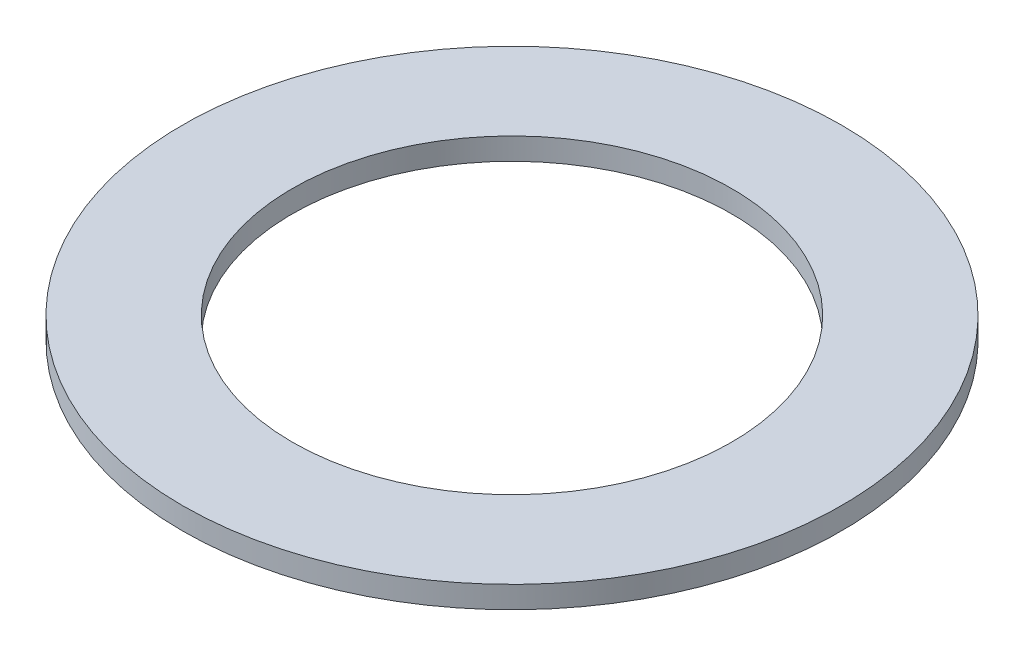
ISO-10303-21;
HEADER;
FILE_DESCRIPTION(('STEP AP214'),'2;1');
FILE_NAME('part.step','',(''),(''),'','','');
FILE_SCHEMA(('AUTOMOTIVE_DESIGN { 1 0 10303 214 1 1 1 1 }'));
ENDSEC;
DATA;
#1=APPLICATION_CONTEXT('core data for automotive mechanical design processes');
#2=APPLICATION_PROTOCOL_DEFINITION('international standard','automotive_design',2000,#1);
#3=PRODUCT_CONTEXT('',#1,'mechanical');
#4=PRODUCT('Part','Part','',(#3));
#5=PRODUCT_RELATED_PRODUCT_CATEGORY('part','',(#4));
#6=PRODUCT_DEFINITION_FORMATION('','',#4);
#7=PRODUCT_DEFINITION_CONTEXT('part definition',#1,'design');
#8=PRODUCT_DEFINITION('design','',#6,#7);
#9=PRODUCT_DEFINITION_SHAPE('','',#8);
#10=(LENGTH_UNIT() NAMED_UNIT(*) SI_UNIT(.MILLI.,.METRE.));
#11=(NAMED_UNIT(*) PLANE_ANGLE_UNIT() SI_UNIT($,.RADIAN.));
#12=(NAMED_UNIT(*) SI_UNIT($,.STERADIAN.) SOLID_ANGLE_UNIT());
#13=UNCERTAINTY_MEASURE_WITH_UNIT(LENGTH_MEASURE(1.E-05),#10,'distance_accuracy_value','');
#14=(GEOMETRIC_REPRESENTATION_CONTEXT(3) GLOBAL_UNCERTAINTY_ASSIGNED_CONTEXT((#13)) GLOBAL_UNIT_ASSIGNED_CONTEXT((#10,
#11,#12)) REPRESENTATION_CONTEXT('',''));
#15=CARTESIAN_POINT('',(0.,0.,0.));
#16=DIRECTION('',(0.,0.,1.));
#17=DIRECTION('',(1.,0.,0.));
#18=AXIS2_PLACEMENT_3D('',#15,#16,#17);
#19=CARTESIAN_POINT('',(0.,5.,0.));
#20=DIRECTION('',(0.,1.,0.));
#21=DIRECTION('',(0.,0.,1.));
#22=AXIS2_PLACEMENT_3D('',#19,#20,#21);
#23=PLANE('',#22);
#24=CARTESIAN_POINT('',(0.,5.,0.));
#25=DIRECTION('',(0.,1.,0.));
#26=DIRECTION('',(0.,0.,1.));
#27=AXIS2_PLACEMENT_3D('',#24,#25,#26);
#28=CIRCLE('',#27,75.);
#29=CARTESIAN_POINT('',(0.,5.,75.));
#30=VERTEX_POINT('',#29);
#31=EDGE_CURVE('E10',#30,#30,#28,.T.);
#32=ORIENTED_EDGE('',*,*,#31,.T.);
#33=EDGE_LOOP('',(#32));
#34=FACE_BOUND('',#33,.T.);
#35=CARTESIAN_POINT('',(0.,5.,0.));
#36=DIRECTION('',(0.,1.,0.));
#37=DIRECTION('',(0.,0.,1.));
#38=AXIS2_PLACEMENT_3D('',#35,#36,#37);
#39=CIRCLE('',#38,50.);
#40=CARTESIAN_POINT('',(0.,5.,50.));
#41=VERTEX_POINT('',#40);
#42=EDGE_CURVE('E54',#41,#41,#39,.T.);
#43=ORIENTED_EDGE('',*,*,#42,.F.);
#44=EDGE_LOOP('',(#43));
#45=FACE_BOUND('',#44,.T.);
#46=ADVANCED_FACE('F41',(#34,#45),#23,.T.);
#47=CARTESIAN_POINT('',(0.,0.,0.));
#48=DIRECTION('',(0.,1.,0.));
#49=DIRECTION('',(0.,0.,1.));
#50=AXIS2_PLACEMENT_3D('',#47,#48,#49);
#51=PLANE('',#50);
#52=CARTESIAN_POINT('',(0.,0.,0.));
#53=DIRECTION('',(0.,1.,0.));
#54=DIRECTION('',(0.,0.,1.));
#55=AXIS2_PLACEMENT_3D('',#52,#53,#54);
#56=CIRCLE('',#55,75.);
#57=CARTESIAN_POINT('',(0.,0.,75.));
#58=VERTEX_POINT('',#57);
#59=EDGE_CURVE('E45',#58,#58,#56,.T.);
#60=ORIENTED_EDGE('',*,*,#59,.F.);
#61=EDGE_LOOP('',(#60));
#62=FACE_BOUND('',#61,.T.);
#63=CARTESIAN_POINT('',(0.,0.,0.));
#64=DIRECTION('',(0.,1.,0.));
#65=DIRECTION('',(0.,0.,1.));
#66=AXIS2_PLACEMENT_3D('',#63,#64,#65);
#67=CIRCLE('',#66,50.);
#68=CARTESIAN_POINT('',(0.,0.,50.));
#69=VERTEX_POINT('',#68);
#70=EDGE_CURVE('E56',#69,#69,#67,.T.);
#71=ORIENTED_EDGE('',*,*,#70,.T.);
#72=EDGE_LOOP('',(#71));
#73=FACE_BOUND('',#72,.T.);
#74=ADVANCED_FACE('F68',(#62,#73),#51,.F.);
#75=CARTESIAN_POINT('',(0.,5.,0.));
#76=DIRECTION('',(0.,-1.,0.));
#77=DIRECTION('',(0.,0.,-1.));
#78=AXIS2_PLACEMENT_3D('',#75,#76,#77);
#79=CYLINDRICAL_SURFACE('',#78,75.);
#80=ORIENTED_EDGE('',*,*,#31,.F.);
#81=EDGE_LOOP('',(#80));
#82=FACE_BOUND('',#81,.T.);
#83=ORIENTED_EDGE('',*,*,#59,.T.);
#84=EDGE_LOOP('',(#83));
#85=FACE_BOUND('',#84,.T.);
#86=ADVANCED_FACE('F43',(#82,#85),#79,.T.);
#87=CARTESIAN_POINT('',(0.,5.,0.));
#88=DIRECTION('',(0.,-1.,0.));
#89=DIRECTION('',(0.,0.,-1.));
#90=AXIS2_PLACEMENT_3D('',#87,#88,#89);
#91=CYLINDRICAL_SURFACE('',#90,50.);
#92=ORIENTED_EDGE('',*,*,#42,.T.);
#93=EDGE_LOOP('',(#92));
#94=FACE_BOUND('',#93,.T.);
#95=ORIENTED_EDGE('',*,*,#70,.F.);
#96=EDGE_LOOP('',(#95));
#97=FACE_BOUND('',#96,.T.);
#98=ADVANCED_FACE('F64',(#94,#97),#91,.F.);
#99=CLOSED_SHELL('',(#46,#74,#86,#98));
#100=MANIFOLD_SOLID_BREP('B2',#99);
#101=ADVANCED_BREP_SHAPE_REPRESENTATION('',(#18,#100),#14);
#102=SHAPE_DEFINITION_REPRESENTATION(#9,#101);
ENDSEC;
END-ISO-10303-21;
